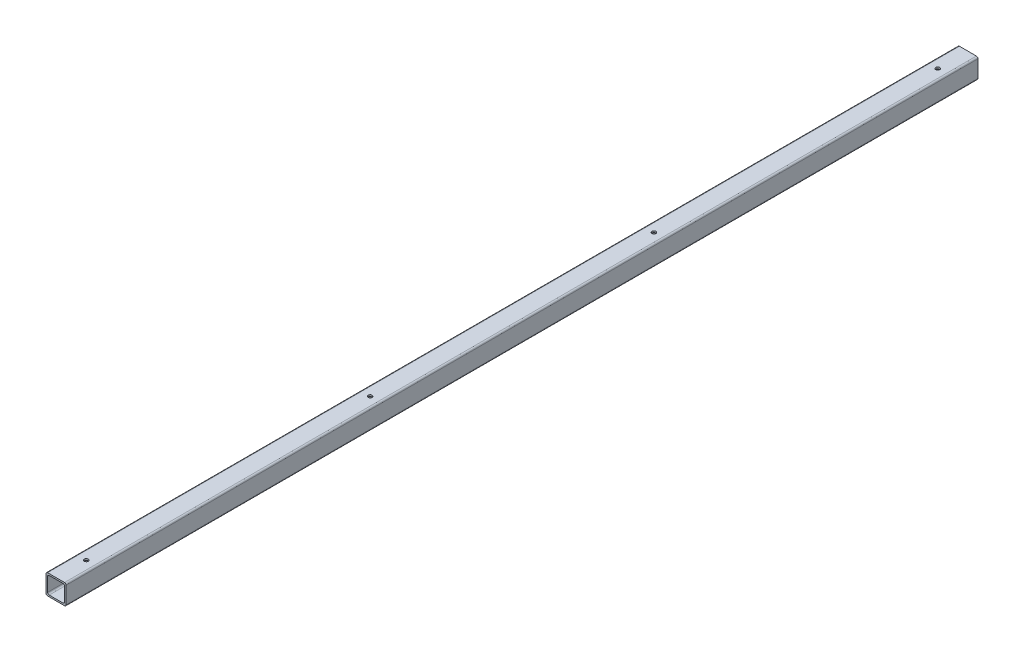
ISO-10303-21;
HEADER;
FILE_DESCRIPTION(('STEP AP214'),'2;1');
FILE_NAME('part.step','',(''),(''),'','','');
FILE_SCHEMA(('AUTOMOTIVE_DESIGN { 1 0 10303 214 1 1 1 1 }'));
ENDSEC;
DATA;
#1=APPLICATION_CONTEXT('core data for automotive mechanical design processes');
#2=APPLICATION_PROTOCOL_DEFINITION('international standard','automotive_design',2000,#1);
#3=PRODUCT_CONTEXT('',#1,'mechanical');
#4=PRODUCT('Part','Part','',(#3));
#5=PRODUCT_RELATED_PRODUCT_CATEGORY('part','',(#4));
#6=PRODUCT_DEFINITION_FORMATION('','',#4);
#7=PRODUCT_DEFINITION_CONTEXT('part definition',#1,'design');
#8=PRODUCT_DEFINITION('design','',#6,#7);
#9=PRODUCT_DEFINITION_SHAPE('','',#8);
#10=(LENGTH_UNIT() NAMED_UNIT(*) SI_UNIT(.MILLI.,.METRE.));
#11=(NAMED_UNIT(*) PLANE_ANGLE_UNIT() SI_UNIT($,.RADIAN.));
#12=(NAMED_UNIT(*) SI_UNIT($,.STERADIAN.) SOLID_ANGLE_UNIT());
#13=UNCERTAINTY_MEASURE_WITH_UNIT(LENGTH_MEASURE(1.E-05),#10,'distance_accuracy_value','');
#14=(GEOMETRIC_REPRESENTATION_CONTEXT(3) GLOBAL_UNCERTAINTY_ASSIGNED_CONTEXT((#13)) GLOBAL_UNIT_ASSIGNED_CONTEXT((#10,
#11,#12)) REPRESENTATION_CONTEXT('',''));
#15=CARTESIAN_POINT('',(0.,0.,0.));
#16=DIRECTION('',(0.,0.,1.));
#17=DIRECTION('',(1.,0.,0.));
#18=AXIS2_PLACEMENT_3D('',#15,#16,#17);
#19=CARTESIAN_POINT('',(0.,-2.7,38.1001000000001));
#20=DIRECTION('',(0.,-1.,0.));
#21=DIRECTION('',(1.,0.,0.));
#22=AXIS2_PLACEMENT_3D('',#19,#20,#21);
#23=CYLINDRICAL_SURFACE('',#22,6.);
#24=CARTESIAN_POINT('',(0.,-10.7,38.1001000000001));
#25=DIRECTION('',(0.,1.,0.));
#26=DIRECTION('',(0.,0.,1.));
#27=AXIS2_PLACEMENT_3D('',#24,#25,#26);
#28=CIRCLE('',#27,6.);
#29=CARTESIAN_POINT('',(0.,-10.7,44.1001000000001));
#30=VERTEX_POINT('',#29);
#31=EDGE_CURVE('E53',#30,#30,#28,.T.);
#32=ORIENTED_EDGE('',*,*,#31,.T.);
#33=EDGE_LOOP('',(#32));
#34=FACE_BOUND('',#33,.T.);
#35=CARTESIAN_POINT('',(0.,-12.7,38.1001000000001));
#36=DIRECTION('',(0.,-1.,0.));
#37=DIRECTION('',(1.,0.,0.));
#38=AXIS2_PLACEMENT_3D('',#35,#36,#37);
#39=CIRCLE('',#38,6.);
#40=CARTESIAN_POINT('',(6.00000000000001,-12.7,38.1001000000001));
#41=VERTEX_POINT('',#40);
#42=EDGE_CURVE('E11',#41,#41,#39,.T.);
#43=ORIENTED_EDGE('',*,*,#42,.T.);
#44=EDGE_LOOP('',(#43));
#45=FACE_BOUND('',#44,.T.);
#46=ADVANCED_FACE('F45',(#34,#45),#23,.F.);
#47=CARTESIAN_POINT('',(0.,-2.7,396.0334));
#48=DIRECTION('',(0.,-1.,0.));
#49=DIRECTION('',(1.,0.,0.));
#50=AXIS2_PLACEMENT_3D('',#47,#48,#49);
#51=CYLINDRICAL_SURFACE('',#50,6.);
#52=CARTESIAN_POINT('',(0.,-10.7,396.0334));
#53=DIRECTION('',(0.,1.,0.));
#54=DIRECTION('',(0.,0.,1.));
#55=AXIS2_PLACEMENT_3D('',#52,#53,#54);
#56=CIRCLE('',#55,6.);
#57=CARTESIAN_POINT('',(0.,-10.7,402.0334));
#58=VERTEX_POINT('',#57);
#59=EDGE_CURVE('E331',#58,#58,#56,.T.);
#60=ORIENTED_EDGE('',*,*,#59,.T.);
#61=EDGE_LOOP('',(#60));
#62=FACE_BOUND('',#61,.T.);
#63=CARTESIAN_POINT('',(0.,-12.7,396.0334));
#64=DIRECTION('',(0.,-1.,0.));
#65=DIRECTION('',(1.,0.,0.));
#66=AXIS2_PLACEMENT_3D('',#63,#64,#65);
#67=CIRCLE('',#66,6.);
#68=CARTESIAN_POINT('',(6.00000000000001,-12.7,396.0334));
#69=VERTEX_POINT('',#68);
#70=EDGE_CURVE('E335',#69,#69,#67,.T.);
#71=ORIENTED_EDGE('',*,*,#70,.T.);
#72=EDGE_LOOP('',(#71));
#73=FACE_BOUND('',#72,.T.);
#74=ADVANCED_FACE('F455',(#62,#73),#51,.F.);
#75=CARTESIAN_POINT('',(0.,-2.7,753.9667));
#76=DIRECTION('',(0.,-1.,0.));
#77=DIRECTION('',(1.,0.,0.));
#78=AXIS2_PLACEMENT_3D('',#75,#76,#77);
#79=CYLINDRICAL_SURFACE('',#78,6.);
#80=CARTESIAN_POINT('',(0.,-10.7,753.9667));
#81=DIRECTION('',(0.,1.,0.));
#82=DIRECTION('',(0.,0.,1.));
#83=AXIS2_PLACEMENT_3D('',#80,#81,#82);
#84=CIRCLE('',#83,6.);
#85=CARTESIAN_POINT('',(0.,-10.7,759.9667));
#86=VERTEX_POINT('',#85);
#87=EDGE_CURVE('E318',#86,#86,#84,.T.);
#88=ORIENTED_EDGE('',*,*,#87,.T.);
#89=EDGE_LOOP('',(#88));
#90=FACE_BOUND('',#89,.T.);
#91=CARTESIAN_POINT('',(0.,-12.7,753.9667));
#92=DIRECTION('',(0.,-1.,0.));
#93=DIRECTION('',(1.,0.,0.));
#94=AXIS2_PLACEMENT_3D('',#91,#92,#93);
#95=CIRCLE('',#94,6.);
#96=CARTESIAN_POINT('',(6.00000000000001,-12.7,753.9667));
#97=VERTEX_POINT('',#96);
#98=EDGE_CURVE('E327',#97,#97,#95,.T.);
#99=ORIENTED_EDGE('',*,*,#98,.T.);
#100=EDGE_LOOP('',(#99));
#101=FACE_BOUND('',#100,.T.);
#102=ADVANCED_FACE('F459',(#90,#101),#79,.F.);
#103=CARTESIAN_POINT('',(0.,2.7,38.1001000000001));
#104=DIRECTION('',(0.,1.,0.));
#105=DIRECTION('',(-1.,0.,0.));
#106=AXIS2_PLACEMENT_3D('',#103,#104,#105);
#107=CYLINDRICAL_SURFACE('',#106,2.49999999999994);
#108=CARTESIAN_POINT('',(0.,10.7,38.1001000000001));
#109=DIRECTION('',(0.,-1.,0.));
#110=DIRECTION('',(0.,0.,-1.));
#111=AXIS2_PLACEMENT_3D('',#108,#109,#110);
#112=CIRCLE('',#111,2.49999999999994);
#113=CARTESIAN_POINT('',(0.,10.7,35.6001000000001));
#114=VERTEX_POINT('',#113);
#115=EDGE_CURVE('E310',#114,#114,#112,.T.);
#116=ORIENTED_EDGE('',*,*,#115,.T.);
#117=EDGE_LOOP('',(#116));
#118=FACE_BOUND('',#117,.T.);
#119=CARTESIAN_POINT('',(0.,12.7,38.1001000000001));
#120=DIRECTION('',(0.,1.,0.));
#121=DIRECTION('',(-1.,0.,0.));
#122=AXIS2_PLACEMENT_3D('',#119,#120,#121);
#123=CIRCLE('',#122,2.49999999999994);
#124=CARTESIAN_POINT('',(-2.49999999999994,12.7,38.1001000000001));
#125=VERTEX_POINT('',#124);
#126=EDGE_CURVE('E314',#125,#125,#123,.T.);
#127=ORIENTED_EDGE('',*,*,#126,.T.);
#128=EDGE_LOOP('',(#127));
#129=FACE_BOUND('',#128,.T.);
#130=ADVANCED_FACE('F464',(#118,#129),#107,.F.);
#131=CARTESIAN_POINT('',(0.,2.7,396.0334));
#132=DIRECTION('',(0.,1.,0.));
#133=DIRECTION('',(-1.,0.,0.));
#134=AXIS2_PLACEMENT_3D('',#131,#132,#133);
#135=CYLINDRICAL_SURFACE('',#134,2.49999999999994);
#136=CARTESIAN_POINT('',(0.,10.7,396.0334));
#137=DIRECTION('',(0.,-1.,0.));
#138=DIRECTION('',(0.,0.,-1.));
#139=AXIS2_PLACEMENT_3D('',#136,#137,#138);
#140=CIRCLE('',#139,2.49999999999994);
#141=CARTESIAN_POINT('',(0.,10.7,393.5334));
#142=VERTEX_POINT('',#141);
#143=EDGE_CURVE('E302',#142,#142,#140,.T.);
#144=ORIENTED_EDGE('',*,*,#143,.T.);
#145=EDGE_LOOP('',(#144));
#146=FACE_BOUND('',#145,.T.);
#147=CARTESIAN_POINT('',(0.,12.7,396.0334));
#148=DIRECTION('',(0.,1.,0.));
#149=DIRECTION('',(-1.,0.,0.));
#150=AXIS2_PLACEMENT_3D('',#147,#148,#149);
#151=CIRCLE('',#150,2.49999999999994);
#152=CARTESIAN_POINT('',(-2.49999999999994,12.7,396.0334));
#153=VERTEX_POINT('',#152);
#154=EDGE_CURVE('E306',#153,#153,#151,.T.);
#155=ORIENTED_EDGE('',*,*,#154,.T.);
#156=EDGE_LOOP('',(#155));
#157=FACE_BOUND('',#156,.T.);
#158=ADVANCED_FACE('F471',(#146,#157),#135,.F.);
#159=CARTESIAN_POINT('',(0.,2.7,753.9667));
#160=DIRECTION('',(0.,1.,0.));
#161=DIRECTION('',(-1.,0.,0.));
#162=AXIS2_PLACEMENT_3D('',#159,#160,#161);
#163=CYLINDRICAL_SURFACE('',#162,2.49999999999994);
#164=CARTESIAN_POINT('',(0.,10.7,753.9667));
#165=DIRECTION('',(0.,-1.,0.));
#166=DIRECTION('',(0.,0.,-1.));
#167=AXIS2_PLACEMENT_3D('',#164,#165,#166);
#168=CIRCLE('',#167,2.49999999999994);
#169=CARTESIAN_POINT('',(0.,10.7,751.4667));
#170=VERTEX_POINT('',#169);
#171=EDGE_CURVE('E290',#170,#170,#168,.T.);
#172=ORIENTED_EDGE('',*,*,#171,.T.);
#173=EDGE_LOOP('',(#172));
#174=FACE_BOUND('',#173,.T.);
#175=CARTESIAN_POINT('',(0.,12.7,753.9667));
#176=DIRECTION('',(0.,1.,0.));
#177=DIRECTION('',(-1.,0.,0.));
#178=AXIS2_PLACEMENT_3D('',#175,#176,#177);
#179=CIRCLE('',#178,2.49999999999994);
#180=CARTESIAN_POINT('',(-2.49999999999994,12.7,753.9667));
#181=VERTEX_POINT('',#180);
#182=EDGE_CURVE('E298',#181,#181,#179,.T.);
#183=ORIENTED_EDGE('',*,*,#182,.T.);
#184=EDGE_LOOP('',(#183));
#185=FACE_BOUND('',#184,.T.);
#186=ADVANCED_FACE('F451',(#174,#185),#163,.F.);
#187=CARTESIAN_POINT('',(0.,0.,1150.));
#188=DIRECTION('',(0.,0.,-1.));
#189=DIRECTION('',(-1.,0.,0.));
#190=AXIS2_PLACEMENT_3D('',#187,#188,#189);
#191=PLANE('',#190);
#192=DIRECTION('',(1.,0.,0.));
#193=VECTOR('',#192,1.);
#194=CARTESIAN_POINT('',(12.7,-12.7,1150.));
#195=LINE('',#194,#193);
#196=CARTESIAN_POINT('',(-10.7,-12.7,1150.));
#197=VERTEX_POINT('',#196);
#198=CARTESIAN_POINT('',(10.7,-12.7,1150.));
#199=VERTEX_POINT('',#198);
#200=EDGE_CURVE('E395',#197,#199,#195,.T.);
#201=ORIENTED_EDGE('',*,*,#200,.T.);
#202=CARTESIAN_POINT('',(10.7,-10.7,1150.));
#203=DIRECTION('',(0.,0.,-1.));
#204=DIRECTION('',(-1.,0.,0.));
#205=AXIS2_PLACEMENT_3D('',#202,#203,#204);
#206=CIRCLE('',#205,2.);
#207=CARTESIAN_POINT('',(12.7,-10.7,1150.));
#208=VERTEX_POINT('',#207);
#209=EDGE_CURVE('E255',#199,#208,#206,.F.);
#210=ORIENTED_EDGE('',*,*,#209,.T.);
#211=DIRECTION('',(0.,1.,0.));
#212=VECTOR('',#211,1.);
#213=CARTESIAN_POINT('',(12.7,12.7,1150.));
#214=LINE('',#213,#212);
#215=CARTESIAN_POINT('',(12.7,10.7,1150.));
#216=VERTEX_POINT('',#215);
#217=EDGE_CURVE('E196',#208,#216,#214,.T.);
#218=ORIENTED_EDGE('',*,*,#217,.T.);
#219=CARTESIAN_POINT('',(10.7,10.7,1150.));
#220=DIRECTION('',(0.,0.,-1.));
#221=DIRECTION('',(-1.,0.,0.));
#222=AXIS2_PLACEMENT_3D('',#219,#220,#221);
#223=CIRCLE('',#222,2.);
#224=CARTESIAN_POINT('',(10.7,12.7,1150.));
#225=VERTEX_POINT('',#224);
#226=EDGE_CURVE('E67',#216,#225,#223,.F.);
#227=ORIENTED_EDGE('',*,*,#226,.T.);
#228=DIRECTION('',(-1.,0.,0.));
#229=VECTOR('',#228,1.);
#230=CARTESIAN_POINT('',(12.7,12.7,1150.));
#231=LINE('',#230,#229);
#232=CARTESIAN_POINT('',(-10.7,12.7,1150.));
#233=VERTEX_POINT('',#232);
#234=EDGE_CURVE('E190',#225,#233,#231,.T.);
#235=ORIENTED_EDGE('',*,*,#234,.T.);
#236=CARTESIAN_POINT('',(-10.7,10.7,1150.));
#237=DIRECTION('',(0.,0.,-1.));
#238=DIRECTION('',(-1.,0.,0.));
#239=AXIS2_PLACEMENT_3D('',#236,#237,#238);
#240=CIRCLE('',#239,2.);
#241=CARTESIAN_POINT('',(-12.7,10.7,1150.));
#242=VERTEX_POINT('',#241);
#243=EDGE_CURVE('E249',#233,#242,#240,.F.);
#244=ORIENTED_EDGE('',*,*,#243,.T.);
#245=DIRECTION('',(0.,-1.,0.));
#246=VECTOR('',#245,1.);
#247=CARTESIAN_POINT('',(-12.7,12.7,1150.));
#248=LINE('',#247,#246);
#249=CARTESIAN_POINT('',(-12.7,-10.7,1150.));
#250=VERTEX_POINT('',#249);
#251=EDGE_CURVE('E391',#242,#250,#248,.T.);
#252=ORIENTED_EDGE('',*,*,#251,.T.);
#253=CARTESIAN_POINT('',(-10.7,-10.7,1150.));
#254=DIRECTION('',(0.,0.,-1.));
#255=DIRECTION('',(-1.,0.,0.));
#256=AXIS2_PLACEMENT_3D('',#253,#254,#255);
#257=CIRCLE('',#256,2.);
#258=EDGE_CURVE('E252',#250,#197,#257,.F.);
#259=ORIENTED_EDGE('',*,*,#258,.T.);
#260=EDGE_LOOP('',(#201,#210,#218,#227,#235,#244,#252,#259));
#261=FACE_BOUND('',#260,.T.);
#262=DIRECTION('',(0.,-1.,0.));
#263=VECTOR('',#262,1.);
#264=CARTESIAN_POINT('',(-10.7,-10.7,1150.));
#265=LINE('',#264,#263);
#266=CARTESIAN_POINT('',(-10.7,8.7,1150.));
#267=VERTEX_POINT('',#266);
#268=CARTESIAN_POINT('',(-10.7,-8.7,1150.));
#269=VERTEX_POINT('',#268);
#270=EDGE_CURVE('E369',#267,#269,#265,.T.);
#271=ORIENTED_EDGE('',*,*,#270,.F.);
#272=CARTESIAN_POINT('',(-8.7,8.7,1150.));
#273=DIRECTION('',(0.,0.,-1.));
#274=DIRECTION('',(-1.,0.,0.));
#275=AXIS2_PLACEMENT_3D('',#272,#273,#274);
#276=CIRCLE('',#275,2.);
#277=CARTESIAN_POINT('',(-8.7,10.7,1150.));
#278=VERTEX_POINT('',#277);
#279=EDGE_CURVE('E172',#267,#278,#276,.T.);
#280=ORIENTED_EDGE('',*,*,#279,.T.);
#281=DIRECTION('',(-1.,0.,0.));
#282=VECTOR('',#281,1.);
#283=CARTESIAN_POINT('',(10.7,10.7,1150.));
#284=LINE('',#283,#282);
#285=CARTESIAN_POINT('',(8.7,10.7,1150.));
#286=VERTEX_POINT('',#285);
#287=EDGE_CURVE('E384',#286,#278,#284,.T.);
#288=ORIENTED_EDGE('',*,*,#287,.F.);
#289=CARTESIAN_POINT('',(8.7,8.7,1150.));
#290=DIRECTION('',(0.,0.,-1.));
#291=DIRECTION('',(-1.,0.,0.));
#292=AXIS2_PLACEMENT_3D('',#289,#290,#291);
#293=CIRCLE('',#292,2.);
#294=CARTESIAN_POINT('',(10.7,8.7,1150.));
#295=VERTEX_POINT('',#294);
#296=EDGE_CURVE('E281',#286,#295,#293,.T.);
#297=ORIENTED_EDGE('',*,*,#296,.T.);
#298=DIRECTION('',(0.,1.,0.));
#299=VECTOR('',#298,1.);
#300=CARTESIAN_POINT('',(10.7,-10.7,1150.));
#301=LINE('',#300,#299);
#302=CARTESIAN_POINT('',(10.7,-8.7,1150.));
#303=VERTEX_POINT('',#302);
#304=EDGE_CURVE('E375',#303,#295,#301,.T.);
#305=ORIENTED_EDGE('',*,*,#304,.F.);
#306=CARTESIAN_POINT('',(8.7,-8.7,1150.));
#307=DIRECTION('',(0.,0.,-1.));
#308=DIRECTION('',(-1.,0.,0.));
#309=AXIS2_PLACEMENT_3D('',#306,#307,#308);
#310=CIRCLE('',#309,2.);
#311=CARTESIAN_POINT('',(8.7,-10.7,1150.));
#312=VERTEX_POINT('',#311);
#313=EDGE_CURVE('E287',#303,#312,#310,.T.);
#314=ORIENTED_EDGE('',*,*,#313,.T.);
#315=DIRECTION('',(1.,0.,0.));
#316=VECTOR('',#315,1.);
#317=CARTESIAN_POINT('',(10.7,-10.7,1150.));
#318=LINE('',#317,#316);
#319=CARTESIAN_POINT('',(-8.7,-10.7,1150.));
#320=VERTEX_POINT('',#319);
#321=EDGE_CURVE('E370',#320,#312,#318,.T.);
#322=ORIENTED_EDGE('',*,*,#321,.F.);
#323=CARTESIAN_POINT('',(-8.7,-8.7,1150.));
#324=DIRECTION('',(0.,0.,-1.));
#325=DIRECTION('',(-1.,0.,0.));
#326=AXIS2_PLACEMENT_3D('',#323,#324,#325);
#327=CIRCLE('',#326,2.);
#328=EDGE_CURVE('E173',#320,#269,#327,.T.);
#329=ORIENTED_EDGE('',*,*,#328,.T.);
#330=EDGE_LOOP('',(#271,#280,#288,#297,#305,#314,#322,#329));
#331=FACE_BOUND('',#330,.T.);
#332=ADVANCED_FACE('F368',(#261,#331),#191,.F.);
#333=CARTESIAN_POINT('',(0.,0.,0.));
#334=DIRECTION('',(0.,0.,-1.));
#335=DIRECTION('',(-1.,0.,0.));
#336=AXIS2_PLACEMENT_3D('',#333,#334,#335);
#337=PLANE('',#336);
#338=DIRECTION('',(0.,1.,0.));
#339=VECTOR('',#338,1.);
#340=CARTESIAN_POINT('',(12.7,12.7,0.));
#341=LINE('',#340,#339);
#342=CARTESIAN_POINT('',(12.7,-10.7,0.));
#343=VERTEX_POINT('',#342);
#344=CARTESIAN_POINT('',(12.7,10.7,0.));
#345=VERTEX_POINT('',#344);
#346=EDGE_CURVE('E407',#343,#345,#341,.T.);
#347=ORIENTED_EDGE('',*,*,#346,.F.);
#348=CARTESIAN_POINT('',(10.7,-10.7,0.));
#349=DIRECTION('',(0.,0.,-1.));
#350=DIRECTION('',(-1.,0.,0.));
#351=AXIS2_PLACEMENT_3D('',#348,#349,#350);
#352=CIRCLE('',#351,2.);
#353=CARTESIAN_POINT('',(10.7,-12.7,0.));
#354=VERTEX_POINT('',#353);
#355=EDGE_CURVE('E237',#343,#354,#352,.T.);
#356=ORIENTED_EDGE('',*,*,#355,.T.);
#357=DIRECTION('',(1.,0.,0.));
#358=VECTOR('',#357,1.);
#359=CARTESIAN_POINT('',(12.7,-12.7,0.));
#360=LINE('',#359,#358);
#361=CARTESIAN_POINT('',(-10.7,-12.7,0.));
#362=VERTEX_POINT('',#361);
#363=EDGE_CURVE('E404',#362,#354,#360,.T.);
#364=ORIENTED_EDGE('',*,*,#363,.F.);
#365=CARTESIAN_POINT('',(-10.7,-10.7,0.));
#366=DIRECTION('',(0.,0.,-1.));
#367=DIRECTION('',(-1.,0.,0.));
#368=AXIS2_PLACEMENT_3D('',#365,#366,#367);
#369=CIRCLE('',#368,2.);
#370=CARTESIAN_POINT('',(-12.7,-10.7,0.));
#371=VERTEX_POINT('',#370);
#372=EDGE_CURVE('E234',#362,#371,#369,.T.);
#373=ORIENTED_EDGE('',*,*,#372,.T.);
#374=DIRECTION('',(0.,-1.,0.));
#375=VECTOR('',#374,1.);
#376=CARTESIAN_POINT('',(-12.7,12.7,0.));
#377=LINE('',#376,#375);
#378=CARTESIAN_POINT('',(-12.7,10.7,0.));
#379=VERTEX_POINT('',#378);
#380=EDGE_CURVE('E387',#379,#371,#377,.T.);
#381=ORIENTED_EDGE('',*,*,#380,.F.);
#382=CARTESIAN_POINT('',(-10.7,10.7,0.));
#383=DIRECTION('',(0.,0.,-1.));
#384=DIRECTION('',(-1.,0.,0.));
#385=AXIS2_PLACEMENT_3D('',#382,#383,#384);
#386=CIRCLE('',#385,2.);
#387=CARTESIAN_POINT('',(-10.7,12.7,0.));
#388=VERTEX_POINT('',#387);
#389=EDGE_CURVE('E231',#379,#388,#386,.T.);
#390=ORIENTED_EDGE('',*,*,#389,.T.);
#391=DIRECTION('',(-1.,0.,0.));
#392=VECTOR('',#391,1.);
#393=CARTESIAN_POINT('',(12.7,12.7,0.));
#394=LINE('',#393,#392);
#395=CARTESIAN_POINT('',(10.7,12.7,0.));
#396=VERTEX_POINT('',#395);
#397=EDGE_CURVE('E199',#396,#388,#394,.T.);
#398=ORIENTED_EDGE('',*,*,#397,.F.);
#399=CARTESIAN_POINT('',(10.7,10.7,0.));
#400=DIRECTION('',(0.,0.,-1.));
#401=DIRECTION('',(-1.,0.,0.));
#402=AXIS2_PLACEMENT_3D('',#399,#400,#401);
#403=CIRCLE('',#402,2.);
#404=EDGE_CURVE('E228',#396,#345,#403,.T.);
#405=ORIENTED_EDGE('',*,*,#404,.T.);
#406=EDGE_LOOP('',(#347,#356,#364,#373,#381,#390,#398,#405));
#407=FACE_BOUND('',#406,.T.);
#408=DIRECTION('',(0.,1.,0.));
#409=VECTOR('',#408,1.);
#410=CARTESIAN_POINT('',(10.7,-10.7,0.));
#411=LINE('',#410,#409);
#412=CARTESIAN_POINT('',(10.7,-8.7,0.));
#413=VERTEX_POINT('',#412);
#414=CARTESIAN_POINT('',(10.7,8.7,0.));
#415=VERTEX_POINT('',#414);
#416=EDGE_CURVE('E362',#413,#415,#411,.T.);
#417=ORIENTED_EDGE('',*,*,#416,.T.);
#418=CARTESIAN_POINT('',(8.7,8.7,0.));
#419=DIRECTION('',(0.,0.,-1.));
#420=DIRECTION('',(-1.,0.,0.));
#421=AXIS2_PLACEMENT_3D('',#418,#419,#420);
#422=CIRCLE('',#421,2.);
#423=CARTESIAN_POINT('',(8.7,10.7,0.));
#424=VERTEX_POINT('',#423);
#425=EDGE_CURVE('E278',#415,#424,#422,.F.);
#426=ORIENTED_EDGE('',*,*,#425,.T.);
#427=DIRECTION('',(-1.,0.,0.));
#428=VECTOR('',#427,1.);
#429=CARTESIAN_POINT('',(10.7,10.7,0.));
#430=LINE('',#429,#428);
#431=CARTESIAN_POINT('',(-8.7,10.7,0.));
#432=VERTEX_POINT('',#431);
#433=EDGE_CURVE('E166',#424,#432,#430,.T.);
#434=ORIENTED_EDGE('',*,*,#433,.T.);
#435=CARTESIAN_POINT('',(-8.7,8.7,0.));
#436=DIRECTION('',(0.,0.,-1.));
#437=DIRECTION('',(-1.,0.,0.));
#438=AXIS2_PLACEMENT_3D('',#435,#436,#437);
#439=CIRCLE('',#438,2.);
#440=CARTESIAN_POINT('',(-10.7,8.7,0.));
#441=VERTEX_POINT('',#440);
#442=EDGE_CURVE('E160',#432,#441,#439,.F.);
#443=ORIENTED_EDGE('',*,*,#442,.T.);
#444=DIRECTION('',(0.,-1.,0.));
#445=VECTOR('',#444,1.);
#446=CARTESIAN_POINT('',(-10.7,-10.7,0.));
#447=LINE('',#446,#445);
#448=CARTESIAN_POINT('',(-10.7,-8.7,0.));
#449=VERTEX_POINT('',#448);
#450=EDGE_CURVE('E164',#441,#449,#447,.T.);
#451=ORIENTED_EDGE('',*,*,#450,.T.);
#452=CARTESIAN_POINT('',(-8.7,-8.7,0.));
#453=DIRECTION('',(0.,0.,-1.));
#454=DIRECTION('',(-1.,0.,0.));
#455=AXIS2_PLACEMENT_3D('',#452,#453,#454);
#456=CIRCLE('',#455,2.);
#457=CARTESIAN_POINT('',(-8.7,-10.7,0.));
#458=VERTEX_POINT('',#457);
#459=EDGE_CURVE('E271',#449,#458,#456,.F.);
#460=ORIENTED_EDGE('',*,*,#459,.T.);
#461=DIRECTION('',(1.,0.,0.));
#462=VECTOR('',#461,1.);
#463=CARTESIAN_POINT('',(10.7,-10.7,0.));
#464=LINE('',#463,#462);
#465=CARTESIAN_POINT('',(8.7,-10.7,0.));
#466=VERTEX_POINT('',#465);
#467=EDGE_CURVE('E184',#458,#466,#464,.T.);
#468=ORIENTED_EDGE('',*,*,#467,.T.);
#469=CARTESIAN_POINT('',(8.7,-8.7,0.));
#470=DIRECTION('',(0.,0.,-1.));
#471=DIRECTION('',(-1.,0.,0.));
#472=AXIS2_PLACEMENT_3D('',#469,#470,#471);
#473=CIRCLE('',#472,2.);
#474=EDGE_CURVE('E284',#466,#413,#473,.F.);
#475=ORIENTED_EDGE('',*,*,#474,.T.);
#476=EDGE_LOOP('',(#417,#426,#434,#443,#451,#460,#468,#475));
#477=FACE_BOUND('',#476,.T.);
#478=ADVANCED_FACE('F163',(#407,#477),#337,.T.);
#479=CARTESIAN_POINT('',(-12.7,12.7,1150.));
#480=DIRECTION('',(1.,0.,0.));
#481=DIRECTION('',(0.,0.,-1.));
#482=AXIS2_PLACEMENT_3D('',#479,#480,#481);
#483=PLANE('',#482);
#484=ORIENTED_EDGE('',*,*,#380,.T.);
#485=DIRECTION('',(0.,0.,-1.));
#486=VECTOR('',#485,1.);
#487=CARTESIAN_POINT('',(-12.7,-10.7,1150.));
#488=LINE('',#487,#486);
#489=EDGE_CURVE('E262',#371,#250,#488,.F.);
#490=ORIENTED_EDGE('',*,*,#489,.T.);
#491=ORIENTED_EDGE('',*,*,#251,.F.);
#492=DIRECTION('',(0.,0.,-1.));
#493=VECTOR('',#492,1.);
#494=CARTESIAN_POINT('',(-12.7,10.7,1150.));
#495=LINE('',#494,#493);
#496=EDGE_CURVE('E258',#242,#379,#495,.T.);
#497=ORIENTED_EDGE('',*,*,#496,.T.);
#498=EDGE_LOOP('',(#484,#490,#491,#497));
#499=FACE_BOUND('',#498,.T.);
#500=ADVANCED_FACE('F425',(#499),#483,.F.);
#501=CARTESIAN_POINT('',(12.7,-12.7,1150.));
#502=DIRECTION('',(0.,1.,0.));
#503=DIRECTION('',(0.,0.,1.));
#504=AXIS2_PLACEMENT_3D('',#501,#502,#503);
#505=PLANE('',#504);
#506=ORIENTED_EDGE('',*,*,#42,.F.);
#507=EDGE_LOOP('',(#506));
#508=FACE_BOUND('',#507,.T.);
#509=ORIENTED_EDGE('',*,*,#70,.F.);
#510=EDGE_LOOP('',(#509));
#511=FACE_BOUND('',#510,.T.);
#512=ORIENTED_EDGE('',*,*,#98,.F.);
#513=EDGE_LOOP('',(#512));
#514=FACE_BOUND('',#513,.T.);
#515=CARTESIAN_POINT('',(0.,-12.7,1111.9));
#516=DIRECTION('',(0.,-1.,0.));
#517=DIRECTION('',(1.,0.,0.));
#518=AXIS2_PLACEMENT_3D('',#515,#516,#517);
#519=CIRCLE('',#518,6.);
#520=CARTESIAN_POINT('',(6.00000000000001,-12.7,1111.9));
#521=VERTEX_POINT('',#520);
#522=EDGE_CURVE('E323',#521,#521,#519,.T.);
#523=ORIENTED_EDGE('',*,*,#522,.F.);
#524=EDGE_LOOP('',(#523));
#525=FACE_BOUND('',#524,.T.);
#526=ORIENTED_EDGE('',*,*,#363,.T.);
#527=DIRECTION('',(0.,0.,-1.));
#528=VECTOR('',#527,1.);
#529=CARTESIAN_POINT('',(10.7,-12.7,1150.));
#530=LINE('',#529,#528);
#531=EDGE_CURVE('E244',#354,#199,#530,.F.);
#532=ORIENTED_EDGE('',*,*,#531,.T.);
#533=ORIENTED_EDGE('',*,*,#200,.F.);
#534=DIRECTION('',(0.,0.,-1.));
#535=VECTOR('',#534,1.);
#536=CARTESIAN_POINT('',(-10.7,-12.7,1150.));
#537=LINE('',#536,#535);
#538=EDGE_CURVE('E240',#197,#362,#537,.T.);
#539=ORIENTED_EDGE('',*,*,#538,.T.);
#540=EDGE_LOOP('',(#526,#532,#533,#539));
#541=FACE_BOUND('',#540,.T.);
#542=ADVANCED_FACE('F434',(#508,#511,#514,#525,#541),#505,.F.);
#543=CARTESIAN_POINT('',(12.7,12.7,1150.));
#544=DIRECTION('',(-1.,0.,0.));
#545=DIRECTION('',(0.,0.,1.));
#546=AXIS2_PLACEMENT_3D('',#543,#544,#545);
#547=PLANE('',#546);
#548=ORIENTED_EDGE('',*,*,#217,.F.);
#549=DIRECTION('',(0.,0.,-1.));
#550=VECTOR('',#549,1.);
#551=CARTESIAN_POINT('',(12.7,-10.7,1150.));
#552=LINE('',#551,#550);
#553=EDGE_CURVE('E224',#208,#343,#552,.T.);
#554=ORIENTED_EDGE('',*,*,#553,.T.);
#555=ORIENTED_EDGE('',*,*,#346,.T.);
#556=DIRECTION('',(0.,0.,-1.));
#557=VECTOR('',#556,1.);
#558=CARTESIAN_POINT('',(12.7,10.7,1150.));
#559=LINE('',#558,#557);
#560=EDGE_CURVE('E221',#345,#216,#559,.F.);
#561=ORIENTED_EDGE('',*,*,#560,.T.);
#562=EDGE_LOOP('',(#548,#554,#555,#561));
#563=FACE_BOUND('',#562,.T.);
#564=ADVANCED_FACE('F441',(#563),#547,.F.);
#565=CARTESIAN_POINT('',(12.7,12.7,1150.));
#566=DIRECTION('',(0.,-1.,0.));
#567=DIRECTION('',(0.,0.,-1.));
#568=AXIS2_PLACEMENT_3D('',#565,#566,#567);
#569=PLANE('',#568);
#570=ORIENTED_EDGE('',*,*,#126,.F.);
#571=EDGE_LOOP('',(#570));
#572=FACE_BOUND('',#571,.T.);
#573=ORIENTED_EDGE('',*,*,#154,.F.);
#574=EDGE_LOOP('',(#573));
#575=FACE_BOUND('',#574,.T.);
#576=ORIENTED_EDGE('',*,*,#182,.F.);
#577=EDGE_LOOP('',(#576));
#578=FACE_BOUND('',#577,.T.);
#579=CARTESIAN_POINT('',(0.,12.7,1111.9));
#580=DIRECTION('',(0.,1.,0.));
#581=DIRECTION('',(-1.,0.,0.));
#582=AXIS2_PLACEMENT_3D('',#579,#580,#581);
#583=CIRCLE('',#582,2.49999999999994);
#584=CARTESIAN_POINT('',(-2.49999999999994,12.7,1111.9));
#585=VERTEX_POINT('',#584);
#586=EDGE_CURVE('E294',#585,#585,#583,.T.);
#587=ORIENTED_EDGE('',*,*,#586,.F.);
#588=EDGE_LOOP('',(#587));
#589=FACE_BOUND('',#588,.T.);
#590=ORIENTED_EDGE('',*,*,#397,.T.);
#591=DIRECTION('',(0.,0.,-1.));
#592=VECTOR('',#591,1.);
#593=CARTESIAN_POINT('',(-10.7,12.7,1150.));
#594=LINE('',#593,#592);
#595=EDGE_CURVE('E60',#388,#233,#594,.F.);
#596=ORIENTED_EDGE('',*,*,#595,.T.);
#597=ORIENTED_EDGE('',*,*,#234,.F.);
#598=DIRECTION('',(0.,0.,-1.));
#599=VECTOR('',#598,1.);
#600=CARTESIAN_POINT('',(10.7,12.7,1150.));
#601=LINE('',#600,#599);
#602=EDGE_CURVE('E265',#225,#396,#601,.T.);
#603=ORIENTED_EDGE('',*,*,#602,.T.);
#604=EDGE_LOOP('',(#590,#596,#597,#603));
#605=FACE_BOUND('',#604,.T.);
#606=ADVANCED_FACE('F415',(#572,#575,#578,#589,#605),#569,.F.);
#607=CARTESIAN_POINT('',(-10.7,-10.7,1150.));
#608=DIRECTION('',(1.,0.,0.));
#609=DIRECTION('',(0.,0.,-1.));
#610=AXIS2_PLACEMENT_3D('',#607,#608,#609);
#611=PLANE('',#610);
#612=ORIENTED_EDGE('',*,*,#270,.T.);
#613=DIRECTION('',(0.,0.,-1.));
#614=VECTOR('',#613,1.);
#615=CARTESIAN_POINT('',(-10.7,-8.7,0.));
#616=LINE('',#615,#614);
#617=EDGE_CURVE('E182',#269,#449,#616,.T.);
#618=ORIENTED_EDGE('',*,*,#617,.T.);
#619=ORIENTED_EDGE('',*,*,#450,.F.);
#620=DIRECTION('',(0.,0.,-1.));
#621=VECTOR('',#620,1.);
#622=CARTESIAN_POINT('',(-10.7,8.7,1150.));
#623=LINE('',#622,#621);
#624=EDGE_CURVE('E179',#441,#267,#623,.F.);
#625=ORIENTED_EDGE('',*,*,#624,.T.);
#626=EDGE_LOOP('',(#612,#618,#619,#625));
#627=FACE_BOUND('',#626,.T.);
#628=ADVANCED_FACE('F178',(#627),#611,.T.);
#629=CARTESIAN_POINT('',(10.7,-10.7,1150.));
#630=DIRECTION('',(0.,1.,0.));
#631=DIRECTION('',(0.,0.,1.));
#632=AXIS2_PLACEMENT_3D('',#629,#630,#631);
#633=PLANE('',#632);
#634=ORIENTED_EDGE('',*,*,#31,.F.);
#635=EDGE_LOOP('',(#634));
#636=FACE_BOUND('',#635,.T.);
#637=ORIENTED_EDGE('',*,*,#59,.F.);
#638=EDGE_LOOP('',(#637));
#639=FACE_BOUND('',#638,.T.);
#640=ORIENTED_EDGE('',*,*,#87,.F.);
#641=EDGE_LOOP('',(#640));
#642=FACE_BOUND('',#641,.T.);
#643=CARTESIAN_POINT('',(0.,-10.7,1111.9));
#644=DIRECTION('',(0.,1.,0.));
#645=DIRECTION('',(0.,0.,1.));
#646=AXIS2_PLACEMENT_3D('',#643,#644,#645);
#647=CIRCLE('',#646,6.);
#648=CARTESIAN_POINT('',(0.,-10.7,1117.9));
#649=VERTEX_POINT('',#648);
#650=EDGE_CURVE('E319',#649,#649,#647,.T.);
#651=ORIENTED_EDGE('',*,*,#650,.F.);
#652=EDGE_LOOP('',(#651));
#653=FACE_BOUND('',#652,.T.);
#654=ORIENTED_EDGE('',*,*,#467,.F.);
#655=DIRECTION('',(0.,0.,-1.));
#656=VECTOR('',#655,1.);
#657=CARTESIAN_POINT('',(-8.7,-10.7,1150.));
#658=LINE('',#657,#656);
#659=EDGE_CURVE('E205',#458,#320,#658,.F.);
#660=ORIENTED_EDGE('',*,*,#659,.T.);
#661=ORIENTED_EDGE('',*,*,#321,.T.);
#662=DIRECTION('',(0.,0.,-1.));
#663=VECTOR('',#662,1.);
#664=CARTESIAN_POINT('',(8.7,-10.7,0.));
#665=LINE('',#664,#663);
#666=EDGE_CURVE('E194',#312,#466,#665,.T.);
#667=ORIENTED_EDGE('',*,*,#666,.T.);
#668=EDGE_LOOP('',(#654,#660,#661,#667));
#669=FACE_BOUND('',#668,.T.);
#670=ADVANCED_FACE('F344',(#636,#639,#642,#653,#669),#633,.T.);
#671=CARTESIAN_POINT('',(10.7,-10.7,1150.));
#672=DIRECTION('',(-1.,0.,0.));
#673=DIRECTION('',(0.,0.,1.));
#674=AXIS2_PLACEMENT_3D('',#671,#672,#673);
#675=PLANE('',#674);
#676=ORIENTED_EDGE('',*,*,#304,.T.);
#677=DIRECTION('',(0.,0.,-1.));
#678=VECTOR('',#677,1.);
#679=CARTESIAN_POINT('',(10.7,8.7,0.));
#680=LINE('',#679,#678);
#681=EDGE_CURVE('E217',#295,#415,#680,.T.);
#682=ORIENTED_EDGE('',*,*,#681,.T.);
#683=ORIENTED_EDGE('',*,*,#416,.F.);
#684=DIRECTION('',(0.,0.,-1.));
#685=VECTOR('',#684,1.);
#686=CARTESIAN_POINT('',(10.7,-8.7,1150.));
#687=LINE('',#686,#685);
#688=EDGE_CURVE('E214',#413,#303,#687,.F.);
#689=ORIENTED_EDGE('',*,*,#688,.T.);
#690=EDGE_LOOP('',(#676,#682,#683,#689));
#691=FACE_BOUND('',#690,.T.);
#692=ADVANCED_FACE('F347',(#691),#675,.T.);
#693=CARTESIAN_POINT('',(10.7,10.7,1150.));
#694=DIRECTION('',(0.,-1.,0.));
#695=DIRECTION('',(0.,0.,-1.));
#696=AXIS2_PLACEMENT_3D('',#693,#694,#695);
#697=PLANE('',#696);
#698=ORIENTED_EDGE('',*,*,#115,.F.);
#699=EDGE_LOOP('',(#698));
#700=FACE_BOUND('',#699,.T.);
#701=ORIENTED_EDGE('',*,*,#143,.F.);
#702=EDGE_LOOP('',(#701));
#703=FACE_BOUND('',#702,.T.);
#704=ORIENTED_EDGE('',*,*,#171,.F.);
#705=EDGE_LOOP('',(#704));
#706=FACE_BOUND('',#705,.T.);
#707=CARTESIAN_POINT('',(0.,10.7,1111.9));
#708=DIRECTION('',(0.,-1.,0.));
#709=DIRECTION('',(0.,0.,-1.));
#710=AXIS2_PLACEMENT_3D('',#707,#708,#709);
#711=CIRCLE('',#710,2.49999999999994);
#712=CARTESIAN_POINT('',(0.,10.7,1109.4));
#713=VERTEX_POINT('',#712);
#714=EDGE_CURVE('E185',#713,#713,#711,.T.);
#715=ORIENTED_EDGE('',*,*,#714,.F.);
#716=EDGE_LOOP('',(#715));
#717=FACE_BOUND('',#716,.T.);
#718=ORIENTED_EDGE('',*,*,#287,.T.);
#719=DIRECTION('',(0.,0.,-1.));
#720=VECTOR('',#719,1.);
#721=CARTESIAN_POINT('',(-8.7,10.7,0.));
#722=LINE('',#721,#720);
#723=EDGE_CURVE('E211',#278,#432,#722,.T.);
#724=ORIENTED_EDGE('',*,*,#723,.T.);
#725=ORIENTED_EDGE('',*,*,#433,.F.);
#726=DIRECTION('',(0.,0.,-1.));
#727=VECTOR('',#726,1.);
#728=CARTESIAN_POINT('',(8.7,10.7,1150.));
#729=LINE('',#728,#727);
#730=EDGE_CURVE('E208',#424,#286,#729,.F.);
#731=ORIENTED_EDGE('',*,*,#730,.T.);
#732=EDGE_LOOP('',(#718,#724,#725,#731));
#733=FACE_BOUND('',#732,.T.);
#734=ADVANCED_FACE('F499',(#700,#703,#706,#717,#733),#697,.T.);
#735=CARTESIAN_POINT('',(-8.7,-8.7,1150.));
#736=DIRECTION('',(0.,0.,1.));
#737=DIRECTION('',(1.,0.,0.));
#738=AXIS2_PLACEMENT_3D('',#735,#736,#737);
#739=CYLINDRICAL_SURFACE('',#738,2.);
#740=ORIENTED_EDGE('',*,*,#328,.F.);
#741=ORIENTED_EDGE('',*,*,#659,.F.);
#742=ORIENTED_EDGE('',*,*,#459,.F.);
#743=ORIENTED_EDGE('',*,*,#617,.F.);
#744=EDGE_LOOP('',(#740,#741,#742,#743));
#745=FACE_BOUND('',#744,.T.);
#746=ADVANCED_FACE('F366',(#745),#739,.F.);
#747=CARTESIAN_POINT('',(-8.7,8.7,1150.));
#748=DIRECTION('',(0.,0.,1.));
#749=DIRECTION('',(1.,0.,0.));
#750=AXIS2_PLACEMENT_3D('',#747,#748,#749);
#751=CYLINDRICAL_SURFACE('',#750,2.);
#752=ORIENTED_EDGE('',*,*,#279,.F.);
#753=ORIENTED_EDGE('',*,*,#624,.F.);
#754=ORIENTED_EDGE('',*,*,#442,.F.);
#755=ORIENTED_EDGE('',*,*,#723,.F.);
#756=EDGE_LOOP('',(#752,#753,#754,#755));
#757=FACE_BOUND('',#756,.T.);
#758=ADVANCED_FACE('F188',(#757),#751,.F.);
#759=CARTESIAN_POINT('',(8.7,8.7,1150.));
#760=DIRECTION('',(0.,0.,1.));
#761=DIRECTION('',(1.,0.,0.));
#762=AXIS2_PLACEMENT_3D('',#759,#760,#761);
#763=CYLINDRICAL_SURFACE('',#762,2.);
#764=ORIENTED_EDGE('',*,*,#296,.F.);
#765=ORIENTED_EDGE('',*,*,#730,.F.);
#766=ORIENTED_EDGE('',*,*,#425,.F.);
#767=ORIENTED_EDGE('',*,*,#681,.F.);
#768=EDGE_LOOP('',(#764,#765,#766,#767));
#769=FACE_BOUND('',#768,.T.);
#770=ADVANCED_FACE('F491',(#769),#763,.F.);
#771=CARTESIAN_POINT('',(8.7,-8.7,1150.));
#772=DIRECTION('',(0.,0.,1.));
#773=DIRECTION('',(1.,0.,0.));
#774=AXIS2_PLACEMENT_3D('',#771,#772,#773);
#775=CYLINDRICAL_SURFACE('',#774,2.);
#776=ORIENTED_EDGE('',*,*,#313,.F.);
#777=ORIENTED_EDGE('',*,*,#688,.F.);
#778=ORIENTED_EDGE('',*,*,#474,.F.);
#779=ORIENTED_EDGE('',*,*,#666,.F.);
#780=EDGE_LOOP('',(#776,#777,#778,#779));
#781=FACE_BOUND('',#780,.T.);
#782=ADVANCED_FACE('F488',(#781),#775,.F.);
#783=CARTESIAN_POINT('',(10.7,-10.7,1150.));
#784=DIRECTION('',(0.,0.,-1.));
#785=DIRECTION('',(-1.,0.,0.));
#786=AXIS2_PLACEMENT_3D('',#783,#784,#785);
#787=CYLINDRICAL_SURFACE('',#786,2.);
#788=ORIENTED_EDGE('',*,*,#209,.F.);
#789=ORIENTED_EDGE('',*,*,#531,.F.);
#790=ORIENTED_EDGE('',*,*,#355,.F.);
#791=ORIENTED_EDGE('',*,*,#553,.F.);
#792=EDGE_LOOP('',(#788,#789,#790,#791));
#793=FACE_BOUND('',#792,.T.);
#794=ADVANCED_FACE('F438',(#793),#787,.T.);
#795=CARTESIAN_POINT('',(-10.7,-10.7,1150.));
#796=DIRECTION('',(0.,0.,-1.));
#797=DIRECTION('',(-1.,0.,0.));
#798=AXIS2_PLACEMENT_3D('',#795,#796,#797);
#799=CYLINDRICAL_SURFACE('',#798,2.);
#800=ORIENTED_EDGE('',*,*,#258,.F.);
#801=ORIENTED_EDGE('',*,*,#489,.F.);
#802=ORIENTED_EDGE('',*,*,#372,.F.);
#803=ORIENTED_EDGE('',*,*,#538,.F.);
#804=EDGE_LOOP('',(#800,#801,#802,#803));
#805=FACE_BOUND('',#804,.T.);
#806=ADVANCED_FACE('F429',(#805),#799,.T.);
#807=CARTESIAN_POINT('',(-10.7,10.7,1150.));
#808=DIRECTION('',(0.,0.,-1.));
#809=DIRECTION('',(-1.,0.,0.));
#810=AXIS2_PLACEMENT_3D('',#807,#808,#809);
#811=CYLINDRICAL_SURFACE('',#810,2.);
#812=ORIENTED_EDGE('',*,*,#243,.F.);
#813=ORIENTED_EDGE('',*,*,#595,.F.);
#814=ORIENTED_EDGE('',*,*,#389,.F.);
#815=ORIENTED_EDGE('',*,*,#496,.F.);
#816=EDGE_LOOP('',(#812,#813,#814,#815));
#817=FACE_BOUND('',#816,.T.);
#818=ADVANCED_FACE('F420',(#817),#811,.T.);
#819=CARTESIAN_POINT('',(10.7,10.7,1150.));
#820=DIRECTION('',(0.,0.,-1.));
#821=DIRECTION('',(-1.,0.,0.));
#822=AXIS2_PLACEMENT_3D('',#819,#820,#821);
#823=CYLINDRICAL_SURFACE('',#822,2.);
#824=ORIENTED_EDGE('',*,*,#226,.F.);
#825=ORIENTED_EDGE('',*,*,#560,.F.);
#826=ORIENTED_EDGE('',*,*,#404,.F.);
#827=ORIENTED_EDGE('',*,*,#602,.F.);
#828=EDGE_LOOP('',(#824,#825,#826,#827));
#829=FACE_BOUND('',#828,.T.);
#830=ADVANCED_FACE('F443',(#829),#823,.T.);
#831=CARTESIAN_POINT('',(0.,2.7,1111.9));
#832=DIRECTION('',(0.,1.,0.));
#833=DIRECTION('',(-1.,0.,0.));
#834=AXIS2_PLACEMENT_3D('',#831,#832,#833);
#835=CYLINDRICAL_SURFACE('',#834,2.49999999999994);
#836=ORIENTED_EDGE('',*,*,#714,.T.);
#837=EDGE_LOOP('',(#836));
#838=FACE_BOUND('',#837,.T.);
#839=ORIENTED_EDGE('',*,*,#586,.T.);
#840=EDGE_LOOP('',(#839));
#841=FACE_BOUND('',#840,.T.);
#842=ADVANCED_FACE('F481',(#838,#841),#835,.F.);
#843=CARTESIAN_POINT('',(0.,-2.7,1111.9));
#844=DIRECTION('',(0.,-1.,0.));
#845=DIRECTION('',(1.,0.,0.));
#846=AXIS2_PLACEMENT_3D('',#843,#844,#845);
#847=CYLINDRICAL_SURFACE('',#846,6.);
#848=ORIENTED_EDGE('',*,*,#650,.T.);
#849=EDGE_LOOP('',(#848));
#850=FACE_BOUND('',#849,.T.);
#851=ORIENTED_EDGE('',*,*,#522,.T.);
#852=EDGE_LOOP('',(#851));
#853=FACE_BOUND('',#852,.T.);
#854=ADVANCED_FACE('F525',(#850,#853),#847,.F.);
#855=CLOSED_SHELL('',(#46,#74,#102,#130,#158,#186,#332,#478,#500,#542,#564,#606,#628,#670,#692,
#734,#746,#758,#770,#782,#794,#806,#818,#830,#842,#854));
#856=MANIFOLD_SOLID_BREP('B2',#855);
#857=ADVANCED_BREP_SHAPE_REPRESENTATION('',(#18,#856),#14);
#858=SHAPE_DEFINITION_REPRESENTATION(#9,#857);
ENDSEC;
END-ISO-10303-21;
